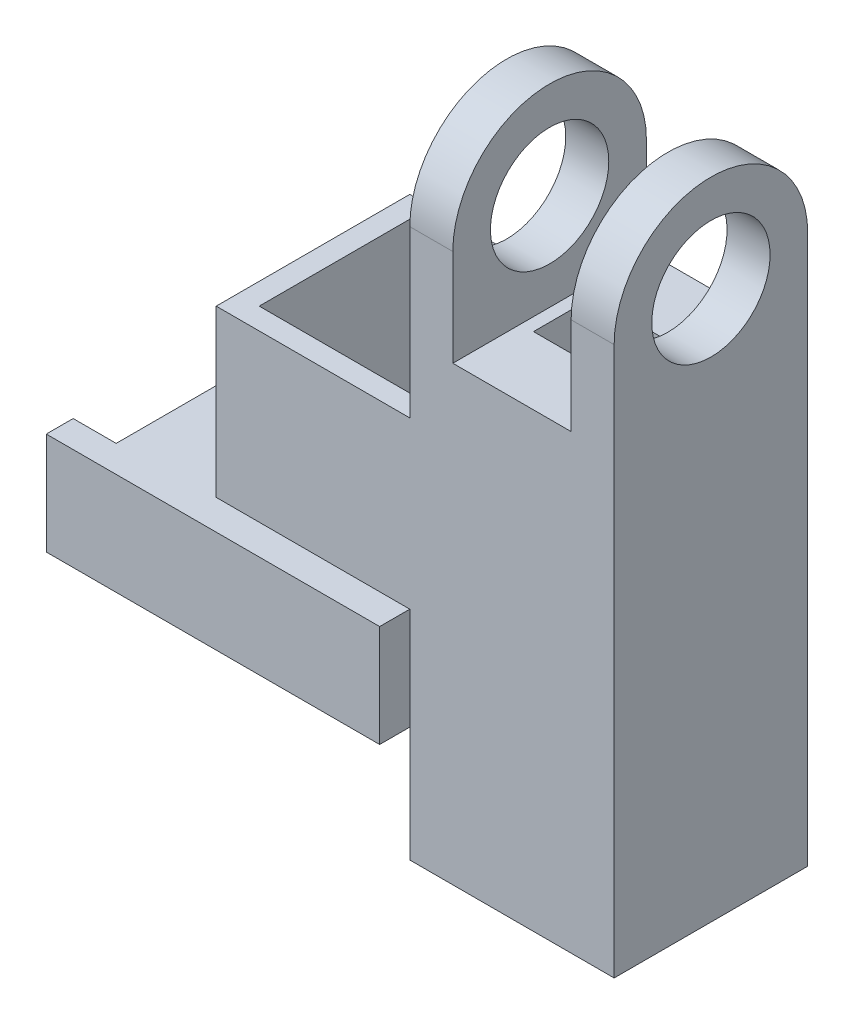
ISO-10303-21;
HEADER;
FILE_DESCRIPTION(('STEP AP214'),'2;1');
FILE_NAME('part.step','',(''),(''),'','','');
FILE_SCHEMA(('AUTOMOTIVE_DESIGN { 1 0 10303 214 1 1 1 1 }'));
ENDSEC;
DATA;
#1=APPLICATION_CONTEXT('core data for automotive mechanical design processes');
#2=APPLICATION_PROTOCOL_DEFINITION('international standard','automotive_design',2000,#1);
#3=PRODUCT_CONTEXT('',#1,'mechanical');
#4=PRODUCT('Part','Part','',(#3));
#5=PRODUCT_RELATED_PRODUCT_CATEGORY('part','',(#4));
#6=PRODUCT_DEFINITION_FORMATION('','',#4);
#7=PRODUCT_DEFINITION_CONTEXT('part definition',#1,'design');
#8=PRODUCT_DEFINITION('design','',#6,#7);
#9=PRODUCT_DEFINITION_SHAPE('','',#8);
#10=(LENGTH_UNIT() NAMED_UNIT(*) SI_UNIT(.MILLI.,.METRE.));
#11=(NAMED_UNIT(*) PLANE_ANGLE_UNIT() SI_UNIT($,.RADIAN.));
#12=(NAMED_UNIT(*) SI_UNIT($,.STERADIAN.) SOLID_ANGLE_UNIT());
#13=UNCERTAINTY_MEASURE_WITH_UNIT(LENGTH_MEASURE(1.E-05),#10,'distance_accuracy_value','');
#14=(GEOMETRIC_REPRESENTATION_CONTEXT(3) GLOBAL_UNCERTAINTY_ASSIGNED_CONTEXT((#13)) GLOBAL_UNIT_ASSIGNED_CONTEXT((#10,
#11,#12)) REPRESENTATION_CONTEXT('',''));
#15=CARTESIAN_POINT('',(0.,0.,0.));
#16=DIRECTION('',(0.,0.,1.));
#17=DIRECTION('',(1.,0.,0.));
#18=AXIS2_PLACEMENT_3D('',#15,#16,#17);
#19=CARTESIAN_POINT('',(-18.,-2.4,-18.));
#20=DIRECTION('',(0.,-1.,0.));
#21=DIRECTION('',(0.,0.,-1.));
#22=AXIS2_PLACEMENT_3D('',#19,#20,#21);
#23=PLANE('',#22);
#24=DIRECTION('',(-1.,0.,0.));
#25=VECTOR('',#24,1.);
#26=CARTESIAN_POINT('',(0.,-2.39999999999999,-2.));
#27=LINE('',#26,#25);
#28=CARTESIAN_POINT('',(0.,-2.39999999999999,-2.));
#29=VERTEX_POINT('',#28);
#30=CARTESIAN_POINT('',(-16.,-2.39999999999999,-2.));
#31=VERTEX_POINT('',#30);
#32=EDGE_CURVE('E54',#29,#31,#27,.T.);
#33=ORIENTED_EDGE('',*,*,#32,.T.);
#34=DIRECTION('',(0.,0.,-1.));
#35=VECTOR('',#34,1.);
#36=CARTESIAN_POINT('',(-16.,-2.39999999999999,0.));
#37=LINE('',#36,#35);
#38=CARTESIAN_POINT('',(-16.,-2.4,-16.));
#39=VERTEX_POINT('',#38);
#40=EDGE_CURVE('E251',#31,#39,#37,.T.);
#41=ORIENTED_EDGE('',*,*,#40,.T.);
#42=DIRECTION('',(1.,0.,0.));
#43=VECTOR('',#42,1.);
#44=CARTESIAN_POINT('',(0.,-2.4,-16.));
#45=LINE('',#44,#43);
#46=CARTESIAN_POINT('',(0.,-2.4,-16.));
#47=VERTEX_POINT('',#46);
#48=EDGE_CURVE('E236',#39,#47,#45,.T.);
#49=ORIENTED_EDGE('',*,*,#48,.T.);
#50=DIRECTION('',(0.,0.,-1.));
#51=VECTOR('',#50,1.);
#52=CARTESIAN_POINT('',(0.,-2.4,-18.));
#53=LINE('',#52,#51);
#54=CARTESIAN_POINT('',(0.,-2.4,-18.));
#55=VERTEX_POINT('',#54);
#56=EDGE_CURVE('E248',#47,#55,#53,.T.);
#57=ORIENTED_EDGE('',*,*,#56,.T.);
#58=DIRECTION('',(1.,0.,0.));
#59=VECTOR('',#58,1.);
#60=CARTESIAN_POINT('',(-18.,-2.4,-18.));
#61=LINE('',#60,#59);
#62=CARTESIAN_POINT('',(-18.,-2.4,-18.));
#63=VERTEX_POINT('',#62);
#64=EDGE_CURVE('E269',#63,#55,#61,.T.);
#65=ORIENTED_EDGE('',*,*,#64,.F.);
#66=DIRECTION('',(0.,0.,-1.));
#67=VECTOR('',#66,1.);
#68=CARTESIAN_POINT('',(-18.,-2.4,-18.));
#69=LINE('',#68,#67);
#70=CARTESIAN_POINT('',(-18.,-2.39999999999999,0.));
#71=VERTEX_POINT('',#70);
#72=EDGE_CURVE('E542',#71,#63,#69,.T.);
#73=ORIENTED_EDGE('',*,*,#72,.F.);
#74=DIRECTION('',(1.,0.,0.));
#75=VECTOR('',#74,1.);
#76=CARTESIAN_POINT('',(-18.,-2.39999999999999,0.));
#77=LINE('',#76,#75);
#78=CARTESIAN_POINT('',(0.,-2.39999999999999,0.));
#79=VERTEX_POINT('',#78);
#80=EDGE_CURVE('E271',#71,#79,#77,.T.);
#81=ORIENTED_EDGE('',*,*,#80,.T.);
#82=EDGE_CURVE('E257',#79,#29,#53,.T.);
#83=ORIENTED_EDGE('',*,*,#82,.T.);
#84=EDGE_LOOP('',(#33,#41,#49,#57,#65,#73,#81,#83));
#85=FACE_BOUND('',#84,.T.);
#86=ADVANCED_FACE('F36',(#85),#23,.F.);
#87=CARTESIAN_POINT('',(0.,13.,-9.));
#88=DIRECTION('',(1.,0.,0.));
#89=DIRECTION('',(0.,0.,-1.));
#90=AXIS2_PLACEMENT_3D('',#87,#88,#89);
#91=PLANE('',#90);
#92=CARTESIAN_POINT('',(0.,13.,-9.));
#93=DIRECTION('',(1.,0.,0.));
#94=DIRECTION('',(0.,0.,-1.));
#95=AXIS2_PLACEMENT_3D('',#92,#93,#94);
#96=CIRCLE('',#95,5.5);
#97=CARTESIAN_POINT('',(0.,13.,-14.5));
#98=VERTEX_POINT('',#97);
#99=EDGE_CURVE('E428',#98,#98,#96,.T.);
#100=ORIENTED_EDGE('',*,*,#99,.T.);
#101=EDGE_LOOP('',(#100));
#102=FACE_BOUND('',#101,.T.);
#103=ORIENTED_EDGE('',*,*,#82,.F.);
#104=DIRECTION('',(0.,-1.,0.));
#105=VECTOR('',#104,1.);
#106=CARTESIAN_POINT('',(0.,13.,0.));
#107=LINE('',#106,#105);
#108=CARTESIAN_POINT('',(0.,13.,0.));
#109=VERTEX_POINT('',#108);
#110=EDGE_CURVE('E472',#109,#79,#107,.T.);
#111=ORIENTED_EDGE('',*,*,#110,.F.);
#112=CARTESIAN_POINT('',(0.,13.,-9.));
#113=DIRECTION('',(1.,0.,0.));
#114=DIRECTION('',(0.,0.,-1.));
#115=AXIS2_PLACEMENT_3D('',#112,#113,#114);
#116=CIRCLE('',#115,9.);
#117=CARTESIAN_POINT('',(0.,13.,-18.));
#118=VERTEX_POINT('',#117);
#119=EDGE_CURVE('E439',#118,#109,#116,.T.);
#120=ORIENTED_EDGE('',*,*,#119,.F.);
#121=DIRECTION('',(0.,1.,0.));
#122=VECTOR('',#121,1.);
#123=CARTESIAN_POINT('',(0.,0.,-18.));
#124=LINE('',#123,#122);
#125=EDGE_CURVE('E40',#55,#118,#124,.T.);
#126=ORIENTED_EDGE('',*,*,#125,.F.);
#127=ORIENTED_EDGE('',*,*,#56,.F.);
#128=DIRECTION('',(0.,1.,0.));
#129=VECTOR('',#128,1.);
#130=CARTESIAN_POINT('',(0.,-39.0602916254693,-16.));
#131=LINE('',#130,#129);
#132=CARTESIAN_POINT('',(0.,-17.8,-16.));
#133=VERTEX_POINT('',#132);
#134=EDGE_CURVE('E232',#133,#47,#131,.T.);
#135=ORIENTED_EDGE('',*,*,#134,.F.);
#136=DIRECTION('',(0.,0.,1.));
#137=VECTOR('',#136,1.);
#138=CARTESIAN_POINT('',(0.,-17.8,0.));
#139=LINE('',#138,#137);
#140=CARTESIAN_POINT('',(0.,-17.8,-1.99999999999999));
#141=VERTEX_POINT('',#140);
#142=EDGE_CURVE('E258',#133,#141,#139,.T.);
#143=ORIENTED_EDGE('',*,*,#142,.T.);
#144=DIRECTION('',(0.,1.,0.));
#145=VECTOR('',#144,1.);
#146=CARTESIAN_POINT('',(0.,-39.0602916254693,-1.99999999999999));
#147=LINE('',#146,#145);
#148=EDGE_CURVE('E244',#141,#29,#147,.T.);
#149=ORIENTED_EDGE('',*,*,#148,.T.);
#150=EDGE_LOOP('',(#103,#111,#120,#126,#127,#135,#143,#149));
#151=FACE_BOUND('',#150,.T.);
#152=ADVANCED_FACE('F255',(#102,#151),#91,.F.);
#153=CARTESIAN_POINT('',(-24.,-17.8,0.));
#154=DIRECTION('',(0.,1.,0.));
#155=DIRECTION('',(0.,0.,1.));
#156=AXIS2_PLACEMENT_3D('',#153,#154,#155);
#157=PLANE('',#156);
#158=DIRECTION('',(0.,0.,1.));
#159=VECTOR('',#158,1.);
#160=CARTESIAN_POINT('',(0.,-17.8,0.));
#161=LINE('',#160,#159);
#162=CARTESIAN_POINT('',(0.,-17.8,0.));
#163=VERTEX_POINT('',#162);
#164=CARTESIAN_POINT('',(0.,-17.8,2.8));
#165=VERTEX_POINT('',#164);
#166=EDGE_CURVE('E349',#163,#165,#161,.T.);
#167=ORIENTED_EDGE('',*,*,#166,.F.);
#168=DIRECTION('',(1.,0.,0.));
#169=VECTOR('',#168,1.);
#170=CARTESIAN_POINT('',(-18.,-17.8,0.));
#171=LINE('',#170,#169);
#172=CARTESIAN_POINT('',(-18.,-17.8,0.));
#173=VERTEX_POINT('',#172);
#174=EDGE_CURVE('E273',#173,#163,#171,.T.);
#175=ORIENTED_EDGE('',*,*,#174,.F.);
#176=DIRECTION('',(0.,0.,1.));
#177=VECTOR('',#176,1.);
#178=CARTESIAN_POINT('',(-18.,-17.8,0.));
#179=LINE('',#178,#177);
#180=CARTESIAN_POINT('',(-18.,-17.8,-18.));
#181=VERTEX_POINT('',#180);
#182=EDGE_CURVE('E261',#181,#173,#179,.T.);
#183=ORIENTED_EDGE('',*,*,#182,.F.);
#184=DIRECTION('',(1.,0.,0.));
#185=VECTOR('',#184,1.);
#186=CARTESIAN_POINT('',(-18.,-17.8,-18.));
#187=LINE('',#186,#185);
#188=CARTESIAN_POINT('',(0.,-17.8,-18.));
#189=VERTEX_POINT('',#188);
#190=EDGE_CURVE('E62',#181,#189,#187,.T.);
#191=ORIENTED_EDGE('',*,*,#190,.T.);
#192=CARTESIAN_POINT('',(0.,-17.8,-20.8));
#193=VERTEX_POINT('',#192);
#194=EDGE_CURVE('E345',#193,#189,#161,.T.);
#195=ORIENTED_EDGE('',*,*,#194,.F.);
#196=DIRECTION('',(1.,0.,0.));
#197=VECTOR('',#196,1.);
#198=CARTESIAN_POINT('',(-28.,-17.8,-20.8));
#199=LINE('',#198,#197);
#200=CARTESIAN_POINT('',(-31.,-17.8,-20.8));
#201=VERTEX_POINT('',#200);
#202=EDGE_CURVE('E330',#201,#193,#199,.T.);
#203=ORIENTED_EDGE('',*,*,#202,.F.);
#204=DIRECTION('',(0.,0.,-1.));
#205=VECTOR('',#204,1.);
#206=CARTESIAN_POINT('',(-31.,-17.8,0.));
#207=LINE('',#206,#205);
#208=CARTESIAN_POINT('',(-31.,-17.8,-18.3));
#209=VERTEX_POINT('',#208);
#210=EDGE_CURVE('E287',#209,#201,#207,.T.);
#211=ORIENTED_EDGE('',*,*,#210,.F.);
#212=DIRECTION('',(1.,0.,0.));
#213=VECTOR('',#212,1.);
#214=CARTESIAN_POINT('',(-28.,-17.8,-18.3));
#215=LINE('',#214,#213);
#216=CARTESIAN_POINT('',(-27.,-17.8,-18.3));
#217=VERTEX_POINT('',#216);
#218=EDGE_CURVE('E332',#209,#217,#215,.T.);
#219=ORIENTED_EDGE('',*,*,#218,.T.);
#220=DIRECTION('',(0.,0.,-1.));
#221=VECTOR('',#220,1.);
#222=CARTESIAN_POINT('',(-27.,-17.8,0.300000000000002));
#223=LINE('',#222,#221);
#224=CARTESIAN_POINT('',(-27.,-17.8,0.300000000000002));
#225=VERTEX_POINT('',#224);
#226=EDGE_CURVE('E311',#225,#217,#223,.T.);
#227=ORIENTED_EDGE('',*,*,#226,.F.);
#228=DIRECTION('',(1.,0.,0.));
#229=VECTOR('',#228,1.);
#230=CARTESIAN_POINT('',(-28.,-17.8,0.300000000000002));
#231=LINE('',#230,#229);
#232=CARTESIAN_POINT('',(-31.,-17.8,0.300000000000002));
#233=VERTEX_POINT('',#232);
#234=EDGE_CURVE('E341',#233,#225,#231,.T.);
#235=ORIENTED_EDGE('',*,*,#234,.F.);
#236=DIRECTION('',(0.,0.,1.));
#237=VECTOR('',#236,1.);
#238=CARTESIAN_POINT('',(-31.,-17.8,0.));
#239=LINE('',#238,#237);
#240=CARTESIAN_POINT('',(-31.,-17.8,2.8));
#241=VERTEX_POINT('',#240);
#242=EDGE_CURVE('E275',#233,#241,#239,.T.);
#243=ORIENTED_EDGE('',*,*,#242,.T.);
#244=DIRECTION('',(1.,0.,0.));
#245=VECTOR('',#244,1.);
#246=CARTESIAN_POINT('',(-28.,-17.8,2.8));
#247=LINE('',#246,#245);
#248=EDGE_CURVE('E317',#241,#165,#247,.T.);
#249=ORIENTED_EDGE('',*,*,#248,.T.);
#250=EDGE_LOOP('',(#167,#175,#183,#191,#195,#203,#211,#219,#227,#235,#243,#249));
#251=FACE_BOUND('',#250,.T.);
#252=ADVANCED_FACE('F580',(#251),#157,.T.);
#253=DIRECTION('',(0.,0.,1.));
#254=VECTOR('',#253,1.);
#255=CARTESIAN_POINT('',(0.,-27.3,0.));
#256=LINE('',#255,#254);
#257=CARTESIAN_POINT('',(0.,-27.3,-18.));
#258=VERTEX_POINT('',#257);
#259=CARTESIAN_POINT('',(0.,-27.3,0.));
#260=VERTEX_POINT('',#259);
#261=EDGE_CURVE('E321',#258,#260,#256,.T.);
#262=ORIENTED_EDGE('',*,*,#261,.F.);
#263=CARTESIAN_POINT('',(0.,-38.,-18.));
#264=VERTEX_POINT('',#263);
#265=EDGE_CURVE('E443',#264,#258,#124,.T.);
#266=ORIENTED_EDGE('',*,*,#265,.F.);
#267=DIRECTION('',(0.,0.,-1.));
#268=VECTOR('',#267,1.);
#269=CARTESIAN_POINT('',(0.,-38.,0.));
#270=LINE('',#269,#268);
#271=CARTESIAN_POINT('',(0.,-38.,0.));
#272=VERTEX_POINT('',#271);
#273=EDGE_CURVE('E362',#272,#264,#270,.T.);
#274=ORIENTED_EDGE('',*,*,#273,.F.);
#275=EDGE_CURVE('E432',#260,#272,#107,.T.);
#276=ORIENTED_EDGE('',*,*,#275,.F.);
#277=EDGE_LOOP('',(#262,#266,#274,#276));
#278=FACE_BOUND('',#277,.T.);
#279=ADVANCED_FACE('F499',(#278),#91,.F.);
#280=CARTESIAN_POINT('',(19.,0.,0.));
#281=DIRECTION('',(0.,1.,0.));
#282=DIRECTION('',(0.,0.,1.));
#283=AXIS2_PLACEMENT_3D('',#280,#281,#282);
#284=PLANE('',#283);
#285=DIRECTION('',(0.,0.,1.));
#286=VECTOR('',#285,1.);
#287=CARTESIAN_POINT('',(5.2,0.,-6.3));
#288=LINE('',#287,#286);
#289=CARTESIAN_POINT('',(5.2,0.,-11.8));
#290=VERTEX_POINT('',#289);
#291=CARTESIAN_POINT('',(5.2,0.,-6.3));
#292=VERTEX_POINT('',#291);
#293=EDGE_CURVE('E382',#290,#292,#288,.T.);
#294=ORIENTED_EDGE('',*,*,#293,.T.);
#295=DIRECTION('',(1.,0.,0.));
#296=VECTOR('',#295,1.);
#297=CARTESIAN_POINT('',(5.2,0.,-6.3));
#298=LINE('',#297,#296);
#299=CARTESIAN_POINT('',(13.7,0.,-6.3));
#300=VERTEX_POINT('',#299);
#301=EDGE_CURVE('E385',#292,#300,#298,.T.);
#302=ORIENTED_EDGE('',*,*,#301,.T.);
#303=DIRECTION('',(0.,0.,-1.));
#304=VECTOR('',#303,1.);
#305=CARTESIAN_POINT('',(13.7,0.,-6.3));
#306=LINE('',#305,#304);
#307=CARTESIAN_POINT('',(13.7,0.,-11.8));
#308=VERTEX_POINT('',#307);
#309=EDGE_CURVE('E388',#300,#308,#306,.T.);
#310=ORIENTED_EDGE('',*,*,#309,.T.);
#311=DIRECTION('',(-1.,0.,0.));
#312=VECTOR('',#311,1.);
#313=CARTESIAN_POINT('',(5.2,0.,-11.8));
#314=LINE('',#313,#312);
#315=EDGE_CURVE('E391',#308,#290,#314,.T.);
#316=ORIENTED_EDGE('',*,*,#315,.T.);
#317=EDGE_LOOP('',(#294,#302,#310,#316));
#318=FACE_BOUND('',#317,.T.);
#319=CARTESIAN_POINT('',(9.5,0.,-9.));
#320=DIRECTION('',(0.,-1.,0.));
#321=DIRECTION('',(0.,0.,-1.));
#322=AXIS2_PLACEMENT_3D('',#319,#320,#321);
#323=CIRCLE('',#322,8.);
#324=CARTESIAN_POINT('',(9.5,0.,-17.));
#325=VERTEX_POINT('',#324);
#326=EDGE_CURVE('E368',#325,#325,#323,.T.);
#327=ORIENTED_EDGE('',*,*,#326,.T.);
#328=EDGE_LOOP('',(#327));
#329=FACE_BOUND('',#328,.T.);
#330=ADVANCED_FACE('F656',(#318,#329),#284,.F.);
#331=CARTESIAN_POINT('',(0.,4.,-18.));
#332=DIRECTION('',(0.,1.,0.));
#333=DIRECTION('',(-1.,0.,0.));
#334=AXIS2_PLACEMENT_3D('',#331,#332,#333);
#335=PLANE('',#334);
#336=DIRECTION('',(1.,0.,0.));
#337=VECTOR('',#336,1.);
#338=CARTESIAN_POINT('',(19.,4.,0.));
#339=LINE('',#338,#337);
#340=CARTESIAN_POINT('',(4.,4.,0.));
#341=VERTEX_POINT('',#340);
#342=CARTESIAN_POINT('',(15.,4.,0.));
#343=VERTEX_POINT('',#342);
#344=EDGE_CURVE('E426',#341,#343,#339,.T.);
#345=ORIENTED_EDGE('',*,*,#344,.T.);
#346=DIRECTION('',(0.,0.,1.));
#347=VECTOR('',#346,1.);
#348=CARTESIAN_POINT('',(15.,4.,-18.));
#349=LINE('',#348,#347);
#350=CARTESIAN_POINT('',(15.,4.,-18.));
#351=VERTEX_POINT('',#350);
#352=EDGE_CURVE('E411',#351,#343,#349,.T.);
#353=ORIENTED_EDGE('',*,*,#352,.F.);
#354=DIRECTION('',(-1.,0.,0.));
#355=VECTOR('',#354,1.);
#356=CARTESIAN_POINT('',(0.,4.,-18.));
#357=LINE('',#356,#355);
#358=CARTESIAN_POINT('',(4.,4.,-18.));
#359=VERTEX_POINT('',#358);
#360=EDGE_CURVE('E406',#351,#359,#357,.T.);
#361=ORIENTED_EDGE('',*,*,#360,.T.);
#362=DIRECTION('',(0.,0.,1.));
#363=VECTOR('',#362,1.);
#364=CARTESIAN_POINT('',(4.,4.,-18.));
#365=LINE('',#364,#363);
#366=EDGE_CURVE('E410',#359,#341,#365,.T.);
#367=ORIENTED_EDGE('',*,*,#366,.T.);
#368=EDGE_LOOP('',(#345,#353,#361,#367));
#369=FACE_BOUND('',#368,.T.);
#370=DIRECTION('',(-1.,0.,0.));
#371=VECTOR('',#370,1.);
#372=CARTESIAN_POINT('',(0.,4.,-6.3));
#373=LINE('',#372,#371);
#374=CARTESIAN_POINT('',(13.7,4.,-6.3));
#375=VERTEX_POINT('',#374);
#376=CARTESIAN_POINT('',(5.2,4.,-6.3));
#377=VERTEX_POINT('',#376);
#378=EDGE_CURVE('E46',#375,#377,#373,.T.);
#379=ORIENTED_EDGE('',*,*,#378,.T.);
#380=DIRECTION('',(0.,0.,-1.));
#381=VECTOR('',#380,1.);
#382=CARTESIAN_POINT('',(5.2,4.,-18.));
#383=LINE('',#382,#381);
#384=CARTESIAN_POINT('',(5.2,4.,-11.8));
#385=VERTEX_POINT('',#384);
#386=EDGE_CURVE('E12',#377,#385,#383,.T.);
#387=ORIENTED_EDGE('',*,*,#386,.T.);
#388=DIRECTION('',(1.,0.,0.));
#389=VECTOR('',#388,1.);
#390=CARTESIAN_POINT('',(0.,4.,-11.8));
#391=LINE('',#390,#389);
#392=CARTESIAN_POINT('',(13.7,4.,-11.8));
#393=VERTEX_POINT('',#392);
#394=EDGE_CURVE('E451',#385,#393,#391,.T.);
#395=ORIENTED_EDGE('',*,*,#394,.T.);
#396=DIRECTION('',(0.,0.,1.));
#397=VECTOR('',#396,1.);
#398=CARTESIAN_POINT('',(13.7,4.,-18.));
#399=LINE('',#398,#397);
#400=EDGE_CURVE('E458',#393,#375,#399,.T.);
#401=ORIENTED_EDGE('',*,*,#400,.T.);
#402=EDGE_LOOP('',(#379,#387,#395,#401));
#403=FACE_BOUND('',#402,.T.);
#404=ADVANCED_FACE('F527',(#369,#403),#335,.T.);
#405=CARTESIAN_POINT('',(19.,13.,0.));
#406=DIRECTION('',(0.,0.,-1.));
#407=DIRECTION('',(-1.,0.,0.));
#408=AXIS2_PLACEMENT_3D('',#405,#406,#407);
#409=PLANE('',#408);
#410=ORIENTED_EDGE('',*,*,#110,.T.);
#411=ORIENTED_EDGE('',*,*,#80,.F.);
#412=DIRECTION('',(0.,1.,0.));
#413=VECTOR('',#412,1.);
#414=CARTESIAN_POINT('',(-18.,-2.39999999999999,0.));
#415=LINE('',#414,#413);
#416=EDGE_CURVE('E540',#173,#71,#415,.T.);
#417=ORIENTED_EDGE('',*,*,#416,.F.);
#418=ORIENTED_EDGE('',*,*,#174,.T.);
#419=EDGE_CURVE('E476',#163,#260,#107,.T.);
#420=ORIENTED_EDGE('',*,*,#419,.T.);
#421=ORIENTED_EDGE('',*,*,#275,.T.);
#422=DIRECTION('',(1.,0.,0.));
#423=VECTOR('',#422,1.);
#424=CARTESIAN_POINT('',(0.,-38.,0.));
#425=LINE('',#424,#423);
#426=CARTESIAN_POINT('',(19.,-38.,0.));
#427=VERTEX_POINT('',#426);
#428=EDGE_CURVE('E359',#272,#427,#425,.T.);
#429=ORIENTED_EDGE('',*,*,#428,.T.);
#430=DIRECTION('',(0.,-1.,0.));
#431=VECTOR('',#430,1.);
#432=CARTESIAN_POINT('',(19.,13.,0.));
#433=LINE('',#432,#431);
#434=CARTESIAN_POINT('',(19.,13.,0.));
#435=VERTEX_POINT('',#434);
#436=EDGE_CURVE('E442',#435,#427,#433,.T.);
#437=ORIENTED_EDGE('',*,*,#436,.F.);
#438=DIRECTION('',(-1.,0.,0.));
#439=VECTOR('',#438,1.);
#440=CARTESIAN_POINT('',(19.,13.,0.));
#441=LINE('',#440,#439);
#442=CARTESIAN_POINT('',(15.,13.,0.));
#443=VERTEX_POINT('',#442);
#444=EDGE_CURVE('E444',#435,#443,#441,.T.);
#445=ORIENTED_EDGE('',*,*,#444,.T.);
#446=DIRECTION('',(0.,1.,0.));
#447=VECTOR('',#446,1.);
#448=CARTESIAN_POINT('',(15.,13.,0.));
#449=LINE('',#448,#447);
#450=EDGE_CURVE('E424',#343,#443,#449,.T.);
#451=ORIENTED_EDGE('',*,*,#450,.F.);
#452=ORIENTED_EDGE('',*,*,#344,.F.);
#453=DIRECTION('',(0.,-1.,0.));
#454=VECTOR('',#453,1.);
#455=CARTESIAN_POINT('',(4.,13.,0.));
#456=LINE('',#455,#454);
#457=CARTESIAN_POINT('',(4.,13.,0.));
#458=VERTEX_POINT('',#457);
#459=EDGE_CURVE('E419',#458,#341,#456,.T.);
#460=ORIENTED_EDGE('',*,*,#459,.F.);
#461=EDGE_CURVE('E437',#458,#109,#441,.T.);
#462=ORIENTED_EDGE('',*,*,#461,.T.);
#463=EDGE_LOOP('',(#410,#411,#417,#418,#420,#421,#429,#437,#445,#451,#452,#460,#462));
#464=FACE_BOUND('',#463,.T.);
#465=ADVANCED_FACE('F38',(#464),#409,.F.);
#466=CARTESIAN_POINT('',(19.,0.,-18.));
#467=DIRECTION('',(0.,0.,1.));
#468=DIRECTION('',(1.,0.,0.));
#469=AXIS2_PLACEMENT_3D('',#466,#467,#468);
#470=PLANE('',#469);
#471=DIRECTION('',(0.,1.,0.));
#472=VECTOR('',#471,1.);
#473=CARTESIAN_POINT('',(0.,0.,-18.));
#474=LINE('',#473,#472);
#475=EDGE_CURVE('E352',#258,#189,#474,.T.);
#476=ORIENTED_EDGE('',*,*,#475,.T.);
#477=ORIENTED_EDGE('',*,*,#190,.F.);
#478=DIRECTION('',(0.,-1.,0.));
#479=VECTOR('',#478,1.);
#480=CARTESIAN_POINT('',(-18.,-17.8,-18.));
#481=LINE('',#480,#479);
#482=EDGE_CURVE('E266',#63,#181,#481,.T.);
#483=ORIENTED_EDGE('',*,*,#482,.F.);
#484=ORIENTED_EDGE('',*,*,#64,.T.);
#485=ORIENTED_EDGE('',*,*,#125,.T.);
#486=DIRECTION('',(-1.,0.,0.));
#487=VECTOR('',#486,1.);
#488=CARTESIAN_POINT('',(19.,13.,-18.));
#489=LINE('',#488,#487);
#490=CARTESIAN_POINT('',(4.,13.,-18.));
#491=VERTEX_POINT('',#490);
#492=EDGE_CURVE('E447',#491,#118,#489,.T.);
#493=ORIENTED_EDGE('',*,*,#492,.F.);
#494=DIRECTION('',(0.,1.,0.));
#495=VECTOR('',#494,1.);
#496=CARTESIAN_POINT('',(4.,0.,-18.));
#497=LINE('',#496,#495);
#498=EDGE_CURVE('E403',#359,#491,#497,.T.);
#499=ORIENTED_EDGE('',*,*,#498,.F.);
#500=ORIENTED_EDGE('',*,*,#360,.F.);
#501=DIRECTION('',(0.,-1.,0.));
#502=VECTOR('',#501,1.);
#503=CARTESIAN_POINT('',(15.,0.,-18.));
#504=LINE('',#503,#502);
#505=CARTESIAN_POINT('',(15.,13.,-18.));
#506=VERTEX_POINT('',#505);
#507=EDGE_CURVE('E408',#506,#351,#504,.T.);
#508=ORIENTED_EDGE('',*,*,#507,.F.);
#509=CARTESIAN_POINT('',(19.,13.,-18.));
#510=VERTEX_POINT('',#509);
#511=EDGE_CURVE('E448',#510,#506,#489,.T.);
#512=ORIENTED_EDGE('',*,*,#511,.F.);
#513=DIRECTION('',(0.,1.,0.));
#514=VECTOR('',#513,1.);
#515=CARTESIAN_POINT('',(19.,0.,-18.));
#516=LINE('',#515,#514);
#517=CARTESIAN_POINT('',(19.,-38.,-18.));
#518=VERTEX_POINT('',#517);
#519=EDGE_CURVE('E438',#518,#510,#516,.T.);
#520=ORIENTED_EDGE('',*,*,#519,.F.);
#521=DIRECTION('',(1.,0.,0.));
#522=VECTOR('',#521,1.);
#523=CARTESIAN_POINT('',(0.,-38.,-18.));
#524=LINE('',#523,#522);
#525=EDGE_CURVE('E369',#264,#518,#524,.T.);
#526=ORIENTED_EDGE('',*,*,#525,.F.);
#527=ORIENTED_EDGE('',*,*,#265,.T.);
#528=EDGE_LOOP('',(#476,#477,#483,#484,#485,#493,#499,#500,#508,#512,#520,#526,#527));
#529=FACE_BOUND('',#528,.T.);
#530=ADVANCED_FACE('F501',(#529),#470,.F.);
#531=CARTESIAN_POINT('',(19.,13.,-9.));
#532=DIRECTION('',(-1.,0.,0.));
#533=DIRECTION('',(0.,0.,1.));
#534=AXIS2_PLACEMENT_3D('',#531,#532,#533);
#535=CYLINDRICAL_SURFACE('',#534,9.);
#536=CARTESIAN_POINT('',(15.,13.,-9.));
#537=DIRECTION('',(-1.,0.,0.));
#538=DIRECTION('',(0.,-1.,0.));
#539=AXIS2_PLACEMENT_3D('',#536,#537,#538);
#540=CIRCLE('',#539,9.);
#541=EDGE_CURVE('E422',#443,#506,#540,.T.);
#542=ORIENTED_EDGE('',*,*,#541,.F.);
#543=ORIENTED_EDGE('',*,*,#444,.F.);
#544=CARTESIAN_POINT('',(19.,13.,-9.));
#545=DIRECTION('',(1.,0.,0.));
#546=DIRECTION('',(0.,0.,-1.));
#547=AXIS2_PLACEMENT_3D('',#544,#545,#546);
#548=CIRCLE('',#547,9.);
#549=EDGE_CURVE('E435',#510,#435,#548,.T.);
#550=ORIENTED_EDGE('',*,*,#549,.F.);
#551=ORIENTED_EDGE('',*,*,#511,.T.);
#552=EDGE_LOOP('',(#542,#543,#550,#551));
#553=FACE_BOUND('',#552,.T.);
#554=ADVANCED_FACE('F517',(#553),#535,.T.);
#555=CARTESIAN_POINT('',(4.,13.,-9.));
#556=DIRECTION('',(1.,0.,0.));
#557=DIRECTION('',(0.,0.,-1.));
#558=AXIS2_PLACEMENT_3D('',#555,#556,#557);
#559=CIRCLE('',#558,9.);
#560=EDGE_CURVE('E417',#491,#458,#559,.T.);
#561=ORIENTED_EDGE('',*,*,#560,.F.);
#562=ORIENTED_EDGE('',*,*,#492,.T.);
#563=ORIENTED_EDGE('',*,*,#119,.T.);
#564=ORIENTED_EDGE('',*,*,#461,.F.);
#565=EDGE_LOOP('',(#561,#562,#563,#564));
#566=FACE_BOUND('',#565,.T.);
#567=ADVANCED_FACE('F535',(#566),#535,.T.);
#568=CARTESIAN_POINT('',(19.,13.,-9.));
#569=DIRECTION('',(-1.,0.,0.));
#570=DIRECTION('',(0.,0.,1.));
#571=AXIS2_PLACEMENT_3D('',#568,#569,#570);
#572=CYLINDRICAL_SURFACE('',#571,5.5);
#573=CARTESIAN_POINT('',(19.,13.,-9.));
#574=DIRECTION('',(1.,0.,0.));
#575=DIRECTION('',(0.,0.,-1.));
#576=AXIS2_PLACEMENT_3D('',#573,#574,#575);
#577=CIRCLE('',#576,5.5);
#578=CARTESIAN_POINT('',(19.,13.,-14.5));
#579=VERTEX_POINT('',#578);
#580=EDGE_CURVE('E429',#579,#579,#577,.T.);
#581=ORIENTED_EDGE('',*,*,#580,.T.);
#582=EDGE_LOOP('',(#581));
#583=FACE_BOUND('',#582,.T.);
#584=CARTESIAN_POINT('',(15.,13.,-9.));
#585=DIRECTION('',(-1.,0.,0.));
#586=DIRECTION('',(0.,-1.,0.));
#587=AXIS2_PLACEMENT_3D('',#584,#585,#586);
#588=CIRCLE('',#587,5.5);
#589=CARTESIAN_POINT('',(15.,7.5,-9.));
#590=VERTEX_POINT('',#589);
#591=EDGE_CURVE('E421',#590,#590,#588,.T.);
#592=ORIENTED_EDGE('',*,*,#591,.T.);
#593=EDGE_LOOP('',(#592));
#594=FACE_BOUND('',#593,.T.);
#595=ADVANCED_FACE('F660',(#583,#594),#572,.F.);
#596=ORIENTED_EDGE('',*,*,#99,.F.);
#597=EDGE_LOOP('',(#596));
#598=FACE_BOUND('',#597,.T.);
#599=CARTESIAN_POINT('',(4.,13.,-9.));
#600=DIRECTION('',(1.,0.,0.));
#601=DIRECTION('',(0.,0.,-1.));
#602=AXIS2_PLACEMENT_3D('',#599,#600,#601);
#603=CIRCLE('',#602,5.5);
#604=CARTESIAN_POINT('',(4.,13.,-14.5));
#605=VERTEX_POINT('',#604);
#606=EDGE_CURVE('E414',#605,#605,#603,.T.);
#607=ORIENTED_EDGE('',*,*,#606,.T.);
#608=EDGE_LOOP('',(#607));
#609=FACE_BOUND('',#608,.T.);
#610=ADVANCED_FACE('F663',(#598,#609),#572,.F.);
#611=CARTESIAN_POINT('',(19.,13.,-9.));
#612=DIRECTION('',(1.,0.,0.));
#613=DIRECTION('',(0.,0.,-1.));
#614=AXIS2_PLACEMENT_3D('',#611,#612,#613);
#615=PLANE('',#614);
#616=ORIENTED_EDGE('',*,*,#436,.T.);
#617=DIRECTION('',(0.,0.,-1.));
#618=VECTOR('',#617,1.);
#619=CARTESIAN_POINT('',(19.,-38.,0.));
#620=LINE('',#619,#618);
#621=EDGE_CURVE('E365',#427,#518,#620,.T.);
#622=ORIENTED_EDGE('',*,*,#621,.T.);
#623=ORIENTED_EDGE('',*,*,#519,.T.);
#624=ORIENTED_EDGE('',*,*,#549,.T.);
#625=EDGE_LOOP('',(#616,#622,#623,#624));
#626=FACE_BOUND('',#625,.T.);
#627=ORIENTED_EDGE('',*,*,#580,.F.);
#628=EDGE_LOOP('',(#627));
#629=FACE_BOUND('',#628,.T.);
#630=ADVANCED_FACE('F512',(#626,#629),#615,.T.);
#631=CARTESIAN_POINT('',(15.,0.,-18.));
#632=DIRECTION('',(-1.,0.,0.));
#633=DIRECTION('',(0.,-1.,0.));
#634=AXIS2_PLACEMENT_3D('',#631,#632,#633);
#635=PLANE('',#634);
#636=ORIENTED_EDGE('',*,*,#591,.F.);
#637=EDGE_LOOP('',(#636));
#638=FACE_BOUND('',#637,.T.);
#639=ORIENTED_EDGE('',*,*,#450,.T.);
#640=ORIENTED_EDGE('',*,*,#541,.T.);
#641=ORIENTED_EDGE('',*,*,#507,.T.);
#642=ORIENTED_EDGE('',*,*,#352,.T.);
#643=EDGE_LOOP('',(#639,#640,#641,#642));
#644=FACE_BOUND('',#643,.T.);
#645=ADVANCED_FACE('F520',(#638,#644),#635,.T.);
#646=CARTESIAN_POINT('',(4.,0.,-18.));
#647=DIRECTION('',(1.,0.,0.));
#648=DIRECTION('',(0.,0.,-1.));
#649=AXIS2_PLACEMENT_3D('',#646,#647,#648);
#650=PLANE('',#649);
#651=ORIENTED_EDGE('',*,*,#606,.F.);
#652=EDGE_LOOP('',(#651));
#653=FACE_BOUND('',#652,.T.);
#654=ORIENTED_EDGE('',*,*,#459,.T.);
#655=ORIENTED_EDGE('',*,*,#366,.F.);
#656=ORIENTED_EDGE('',*,*,#498,.T.);
#657=ORIENTED_EDGE('',*,*,#560,.T.);
#658=EDGE_LOOP('',(#654,#655,#656,#657));
#659=FACE_BOUND('',#658,.T.);
#660=ADVANCED_FACE('F531',(#653,#659),#650,.T.);
#661=CARTESIAN_POINT('',(5.2,19.,-6.3));
#662=DIRECTION('',(1.,0.,0.));
#663=DIRECTION('',(0.,0.,-1.));
#664=AXIS2_PLACEMENT_3D('',#661,#662,#663);
#665=PLANE('',#664);
#666=DIRECTION('',(0.,-1.,0.));
#667=VECTOR('',#666,1.);
#668=CARTESIAN_POINT('',(5.2,19.,-6.3));
#669=LINE('',#668,#667);
#670=EDGE_CURVE('E401',#377,#292,#669,.T.);
#671=ORIENTED_EDGE('',*,*,#670,.T.);
#672=ORIENTED_EDGE('',*,*,#293,.F.);
#673=DIRECTION('',(0.,-1.,0.));
#674=VECTOR('',#673,1.);
#675=CARTESIAN_POINT('',(5.2,19.,-11.8));
#676=LINE('',#675,#674);
#677=EDGE_CURVE('E394',#385,#290,#676,.T.);
#678=ORIENTED_EDGE('',*,*,#677,.F.);
#679=ORIENTED_EDGE('',*,*,#386,.F.);
#680=EDGE_LOOP('',(#671,#672,#678,#679));
#681=FACE_BOUND('',#680,.T.);
#682=ADVANCED_FACE('F646',(#681),#665,.T.);
#683=CARTESIAN_POINT('',(5.2,19.,-6.3));
#684=DIRECTION('',(0.,0.,-1.));
#685=DIRECTION('',(-1.,0.,0.));
#686=AXIS2_PLACEMENT_3D('',#683,#684,#685);
#687=PLANE('',#686);
#688=DIRECTION('',(0.,-1.,0.));
#689=VECTOR('',#688,1.);
#690=CARTESIAN_POINT('',(13.7,19.,-6.3));
#691=LINE('',#690,#689);
#692=EDGE_CURVE('E399',#375,#300,#691,.T.);
#693=ORIENTED_EDGE('',*,*,#692,.T.);
#694=ORIENTED_EDGE('',*,*,#301,.F.);
#695=ORIENTED_EDGE('',*,*,#670,.F.);
#696=ORIENTED_EDGE('',*,*,#378,.F.);
#697=EDGE_LOOP('',(#693,#694,#695,#696));
#698=FACE_BOUND('',#697,.T.);
#699=ADVANCED_FACE('F642',(#698),#687,.T.);
#700=CARTESIAN_POINT('',(13.7,19.,-6.3));
#701=DIRECTION('',(-1.,0.,0.));
#702=DIRECTION('',(0.,0.,1.));
#703=AXIS2_PLACEMENT_3D('',#700,#701,#702);
#704=PLANE('',#703);
#705=DIRECTION('',(0.,-1.,0.));
#706=VECTOR('',#705,1.);
#707=CARTESIAN_POINT('',(13.7,19.,-11.8));
#708=LINE('',#707,#706);
#709=EDGE_CURVE('E397',#393,#308,#708,.T.);
#710=ORIENTED_EDGE('',*,*,#709,.T.);
#711=ORIENTED_EDGE('',*,*,#309,.F.);
#712=ORIENTED_EDGE('',*,*,#692,.F.);
#713=ORIENTED_EDGE('',*,*,#400,.F.);
#714=EDGE_LOOP('',(#710,#711,#712,#713));
#715=FACE_BOUND('',#714,.T.);
#716=ADVANCED_FACE('F638',(#715),#704,.T.);
#717=CARTESIAN_POINT('',(5.2,19.,-11.8));
#718=DIRECTION('',(0.,0.,1.));
#719=DIRECTION('',(1.,0.,0.));
#720=AXIS2_PLACEMENT_3D('',#717,#718,#719);
#721=PLANE('',#720);
#722=ORIENTED_EDGE('',*,*,#677,.T.);
#723=ORIENTED_EDGE('',*,*,#315,.F.);
#724=ORIENTED_EDGE('',*,*,#709,.F.);
#725=ORIENTED_EDGE('',*,*,#394,.F.);
#726=EDGE_LOOP('',(#722,#723,#724,#725));
#727=FACE_BOUND('',#726,.T.);
#728=ADVANCED_FACE('F634',(#727),#721,.T.);
#729=CARTESIAN_POINT('',(9.5,-20.,-9.));
#730=DIRECTION('',(0.,1.,0.));
#731=DIRECTION('',(0.,0.,1.));
#732=AXIS2_PLACEMENT_3D('',#729,#730,#731);
#733=CYLINDRICAL_SURFACE('',#732,8.);
#734=ORIENTED_EDGE('',*,*,#326,.F.);
#735=EDGE_LOOP('',(#734));
#736=FACE_BOUND('',#735,.T.);
#737=CARTESIAN_POINT('',(9.5,-38.,-9.));
#738=DIRECTION('',(0.,1.,0.));
#739=DIRECTION('',(0.,0.,1.));
#740=AXIS2_PLACEMENT_3D('',#737,#738,#739);
#741=CIRCLE('',#740,8.);
#742=CARTESIAN_POINT('',(9.5,-38.,-1.));
#743=VERTEX_POINT('',#742);
#744=EDGE_CURVE('E356',#743,#743,#741,.T.);
#745=ORIENTED_EDGE('',*,*,#744,.F.);
#746=EDGE_LOOP('',(#745));
#747=FACE_BOUND('',#746,.T.);
#748=ADVANCED_FACE('F631',(#736,#747),#733,.F.);
#749=CARTESIAN_POINT('',(0.,-38.,0.));
#750=DIRECTION('',(0.,-1.,0.));
#751=DIRECTION('',(0.,0.,-1.));
#752=AXIS2_PLACEMENT_3D('',#749,#750,#751);
#753=PLANE('',#752);
#754=ORIENTED_EDGE('',*,*,#621,.F.);
#755=ORIENTED_EDGE('',*,*,#428,.F.);
#756=ORIENTED_EDGE('',*,*,#273,.T.);
#757=ORIENTED_EDGE('',*,*,#525,.T.);
#758=EDGE_LOOP('',(#754,#755,#756,#757));
#759=FACE_BOUND('',#758,.T.);
#760=ORIENTED_EDGE('',*,*,#744,.T.);
#761=EDGE_LOOP('',(#760));
#762=FACE_BOUND('',#761,.T.);
#763=ADVANCED_FACE('F506',(#759,#762),#753,.T.);
#764=CARTESIAN_POINT('',(0.,13.,-9.));
#765=DIRECTION('',(1.,0.,0.));
#766=DIRECTION('',(0.,0.,-1.));
#767=AXIS2_PLACEMENT_3D('',#764,#765,#766);
#768=PLANE('',#767);
#769=ORIENTED_EDGE('',*,*,#419,.F.);
#770=ORIENTED_EDGE('',*,*,#166,.T.);
#771=DIRECTION('',(0.,1.,0.));
#772=VECTOR('',#771,1.);
#773=CARTESIAN_POINT('',(0.,0.,2.8));
#774=LINE('',#773,#772);
#775=CARTESIAN_POINT('',(0.,-27.3,2.8));
#776=VERTEX_POINT('',#775);
#777=EDGE_CURVE('E313',#776,#165,#774,.T.);
#778=ORIENTED_EDGE('',*,*,#777,.F.);
#779=EDGE_CURVE('E322',#260,#776,#256,.T.);
#780=ORIENTED_EDGE('',*,*,#779,.F.);
#781=EDGE_LOOP('',(#769,#770,#778,#780));
#782=FACE_BOUND('',#781,.T.);
#783=ADVANCED_FACE('F493',(#782),#768,.T.);
#784=ORIENTED_EDGE('',*,*,#475,.F.);
#785=CARTESIAN_POINT('',(0.,-27.3,-20.8));
#786=VERTEX_POINT('',#785);
#787=EDGE_CURVE('E318',#786,#258,#256,.T.);
#788=ORIENTED_EDGE('',*,*,#787,.F.);
#789=DIRECTION('',(0.,1.,0.));
#790=VECTOR('',#789,1.);
#791=CARTESIAN_POINT('',(0.,0.,-20.8));
#792=LINE('',#791,#790);
#793=EDGE_CURVE('E314',#786,#193,#792,.T.);
#794=ORIENTED_EDGE('',*,*,#793,.T.);
#795=ORIENTED_EDGE('',*,*,#194,.T.);
#796=EDGE_LOOP('',(#784,#788,#794,#795));
#797=FACE_BOUND('',#796,.T.);
#798=ADVANCED_FACE('F615',(#797),#768,.T.);
#799=CARTESIAN_POINT('',(-28.,0.,0.300000000000002));
#800=DIRECTION('',(0.,0.,-1.));
#801=DIRECTION('',(-1.,0.,0.));
#802=AXIS2_PLACEMENT_3D('',#799,#800,#801);
#803=PLANE('',#802);
#804=DIRECTION('',(0.,1.,0.));
#805=VECTOR('',#804,1.);
#806=CARTESIAN_POINT('',(-27.,-24.8,0.300000000000002));
#807=LINE('',#806,#805);
#808=CARTESIAN_POINT('',(-27.,-24.8,0.300000000000002));
#809=VERTEX_POINT('',#808);
#810=EDGE_CURVE('E309',#809,#225,#807,.T.);
#811=ORIENTED_EDGE('',*,*,#810,.F.);
#812=DIRECTION('',(1.,0.,0.));
#813=VECTOR('',#812,1.);
#814=CARTESIAN_POINT('',(-28.,-24.8,0.300000000000002));
#815=LINE('',#814,#813);
#816=CARTESIAN_POINT('',(-31.,-24.8,0.300000000000002));
#817=VERTEX_POINT('',#816);
#818=EDGE_CURVE('E338',#817,#809,#815,.T.);
#819=ORIENTED_EDGE('',*,*,#818,.F.);
#820=DIRECTION('',(0.,1.,0.));
#821=VECTOR('',#820,1.);
#822=CARTESIAN_POINT('',(-31.,0.,0.300000000000002));
#823=LINE('',#822,#821);
#824=EDGE_CURVE('E278',#817,#233,#823,.T.);
#825=ORIENTED_EDGE('',*,*,#824,.T.);
#826=ORIENTED_EDGE('',*,*,#234,.T.);
#827=EDGE_LOOP('',(#811,#819,#825,#826));
#828=FACE_BOUND('',#827,.T.);
#829=ADVANCED_FACE('F611',(#828),#803,.T.);
#830=CARTESIAN_POINT('',(-28.,-24.8,0.));
#831=DIRECTION('',(0.,1.,0.));
#832=DIRECTION('',(0.,0.,1.));
#833=AXIS2_PLACEMENT_3D('',#830,#831,#832);
#834=PLANE('',#833);
#835=DIRECTION('',(0.,0.,1.));
#836=VECTOR('',#835,1.);
#837=CARTESIAN_POINT('',(-27.,-24.8,-18.3));
#838=LINE('',#837,#836);
#839=CARTESIAN_POINT('',(-27.,-24.8,-18.3));
#840=VERTEX_POINT('',#839);
#841=EDGE_CURVE('E307',#840,#809,#838,.T.);
#842=ORIENTED_EDGE('',*,*,#841,.F.);
#843=DIRECTION('',(1.,0.,0.));
#844=VECTOR('',#843,1.);
#845=CARTESIAN_POINT('',(-28.,-24.8,-18.3));
#846=LINE('',#845,#844);
#847=CARTESIAN_POINT('',(-31.,-24.8,-18.3));
#848=VERTEX_POINT('',#847);
#849=EDGE_CURVE('E335',#848,#840,#846,.T.);
#850=ORIENTED_EDGE('',*,*,#849,.F.);
#851=DIRECTION('',(0.,0.,1.));
#852=VECTOR('',#851,1.);
#853=CARTESIAN_POINT('',(-31.,-24.8,0.));
#854=LINE('',#853,#852);
#855=EDGE_CURVE('E281',#848,#817,#854,.T.);
#856=ORIENTED_EDGE('',*,*,#855,.T.);
#857=ORIENTED_EDGE('',*,*,#818,.T.);
#858=EDGE_LOOP('',(#842,#850,#856,#857));
#859=FACE_BOUND('',#858,.T.);
#860=ADVANCED_FACE('F607',(#859),#834,.T.);
#861=CARTESIAN_POINT('',(-28.,0.,-18.3));
#862=DIRECTION('',(0.,0.,-1.));
#863=DIRECTION('',(-1.,0.,0.));
#864=AXIS2_PLACEMENT_3D('',#861,#862,#863);
#865=PLANE('',#864);
#866=ORIENTED_EDGE('',*,*,#849,.T.);
#867=DIRECTION('',(0.,-1.,0.));
#868=VECTOR('',#867,1.);
#869=CARTESIAN_POINT('',(-27.,-17.8,-18.3));
#870=LINE('',#869,#868);
#871=EDGE_CURVE('E305',#217,#840,#870,.T.);
#872=ORIENTED_EDGE('',*,*,#871,.F.);
#873=ORIENTED_EDGE('',*,*,#218,.F.);
#874=DIRECTION('',(0.,1.,0.));
#875=VECTOR('',#874,1.);
#876=CARTESIAN_POINT('',(-31.,0.,-18.3));
#877=LINE('',#876,#875);
#878=EDGE_CURVE('E284',#848,#209,#877,.T.);
#879=ORIENTED_EDGE('',*,*,#878,.F.);
#880=EDGE_LOOP('',(#866,#872,#873,#879));
#881=FACE_BOUND('',#880,.T.);
#882=ADVANCED_FACE('F603',(#881),#865,.F.);
#883=CARTESIAN_POINT('',(-28.,0.,-20.8));
#884=DIRECTION('',(0.,0.,-1.));
#885=DIRECTION('',(-1.,0.,0.));
#886=AXIS2_PLACEMENT_3D('',#883,#884,#885);
#887=PLANE('',#886);
#888=ORIENTED_EDGE('',*,*,#202,.T.);
#889=ORIENTED_EDGE('',*,*,#793,.F.);
#890=DIRECTION('',(1.,0.,0.));
#891=VECTOR('',#890,1.);
#892=CARTESIAN_POINT('',(-28.,-27.3,-20.8));
#893=LINE('',#892,#891);
#894=CARTESIAN_POINT('',(-31.,-27.3,-20.8));
#895=VERTEX_POINT('',#894);
#896=EDGE_CURVE('E328',#895,#786,#893,.T.);
#897=ORIENTED_EDGE('',*,*,#896,.F.);
#898=DIRECTION('',(0.,1.,0.));
#899=VECTOR('',#898,1.);
#900=CARTESIAN_POINT('',(-31.,0.,-20.8));
#901=LINE('',#900,#899);
#902=EDGE_CURVE('E290',#895,#201,#901,.T.);
#903=ORIENTED_EDGE('',*,*,#902,.T.);
#904=EDGE_LOOP('',(#888,#889,#897,#903));
#905=FACE_BOUND('',#904,.T.);
#906=ADVANCED_FACE('F600',(#905),#887,.T.);
#907=CARTESIAN_POINT('',(-28.,-27.3,0.));
#908=DIRECTION('',(0.,1.,0.));
#909=DIRECTION('',(0.,0.,1.));
#910=AXIS2_PLACEMENT_3D('',#907,#908,#909);
#911=PLANE('',#910);
#912=ORIENTED_EDGE('',*,*,#896,.T.);
#913=ORIENTED_EDGE('',*,*,#787,.T.);
#914=ORIENTED_EDGE('',*,*,#261,.T.);
#915=ORIENTED_EDGE('',*,*,#779,.T.);
#916=DIRECTION('',(1.,0.,0.));
#917=VECTOR('',#916,1.);
#918=CARTESIAN_POINT('',(-28.,-27.3,2.8));
#919=LINE('',#918,#917);
#920=CARTESIAN_POINT('',(-31.,-27.3,2.8));
#921=VERTEX_POINT('',#920);
#922=EDGE_CURVE('E326',#921,#776,#919,.T.);
#923=ORIENTED_EDGE('',*,*,#922,.F.);
#924=DIRECTION('',(0.,0.,1.));
#925=VECTOR('',#924,1.);
#926=CARTESIAN_POINT('',(-31.,-27.3,0.));
#927=LINE('',#926,#925);
#928=EDGE_CURVE('E293',#895,#921,#927,.T.);
#929=ORIENTED_EDGE('',*,*,#928,.F.);
#930=EDGE_LOOP('',(#912,#913,#914,#915,#923,#929));
#931=FACE_BOUND('',#930,.T.);
#932=ADVANCED_FACE('F496',(#931),#911,.F.);
#933=CARTESIAN_POINT('',(-28.,0.,2.8));
#934=DIRECTION('',(0.,0.,-1.));
#935=DIRECTION('',(0.,1.,0.));
#936=AXIS2_PLACEMENT_3D('',#933,#934,#935);
#937=PLANE('',#936);
#938=ORIENTED_EDGE('',*,*,#922,.T.);
#939=ORIENTED_EDGE('',*,*,#777,.T.);
#940=ORIENTED_EDGE('',*,*,#248,.F.);
#941=DIRECTION('',(0.,1.,0.));
#942=VECTOR('',#941,1.);
#943=CARTESIAN_POINT('',(-31.,0.,2.8));
#944=LINE('',#943,#942);
#945=EDGE_CURVE('E296',#921,#241,#944,.T.);
#946=ORIENTED_EDGE('',*,*,#945,.F.);
#947=EDGE_LOOP('',(#938,#939,#940,#946));
#948=FACE_BOUND('',#947,.T.);
#949=ADVANCED_FACE('F593',(#948),#937,.F.);
#950=CARTESIAN_POINT('',(-27.,0.,0.));
#951=DIRECTION('',(-1.,0.,0.));
#952=DIRECTION('',(0.,0.,1.));
#953=AXIS2_PLACEMENT_3D('',#950,#951,#952);
#954=PLANE('',#953);
#955=CARTESIAN_POINT('',(-27.,-21.6,-14.));
#956=DIRECTION('',(-1.,0.,0.));
#957=DIRECTION('',(0.,0.,1.));
#958=AXIS2_PLACEMENT_3D('',#955,#956,#957);
#959=CIRCLE('',#958,2.1);
#960=CARTESIAN_POINT('',(-27.,-21.6,-11.9));
#961=VERTEX_POINT('',#960);
#962=EDGE_CURVE('E302',#961,#961,#959,.T.);
#963=ORIENTED_EDGE('',*,*,#962,.F.);
#964=EDGE_LOOP('',(#963));
#965=FACE_BOUND('',#964,.T.);
#966=ORIENTED_EDGE('',*,*,#871,.T.);
#967=ORIENTED_EDGE('',*,*,#841,.T.);
#968=ORIENTED_EDGE('',*,*,#810,.T.);
#969=ORIENTED_EDGE('',*,*,#226,.T.);
#970=EDGE_LOOP('',(#966,#967,#968,#969));
#971=FACE_BOUND('',#970,.T.);
#972=CARTESIAN_POINT('',(-27.,-21.6,-4.));
#973=DIRECTION('',(-1.,0.,0.));
#974=DIRECTION('',(0.,0.,1.));
#975=AXIS2_PLACEMENT_3D('',#972,#973,#974);
#976=CIRCLE('',#975,2.1);
#977=CARTESIAN_POINT('',(-27.,-21.6,-1.9));
#978=VERTEX_POINT('',#977);
#979=EDGE_CURVE('E299',#978,#978,#976,.T.);
#980=ORIENTED_EDGE('',*,*,#979,.F.);
#981=EDGE_LOOP('',(#980));
#982=FACE_BOUND('',#981,.T.);
#983=ADVANCED_FACE('F589',(#965,#971,#982),#954,.T.);
#984=CARTESIAN_POINT('',(0.,-21.6,-4.));
#985=DIRECTION('',(1.,0.,0.));
#986=DIRECTION('',(0.,0.,-1.));
#987=AXIS2_PLACEMENT_3D('',#984,#985,#986);
#988=CIRCLE('',#987,2.1);
#989=CARTESIAN_POINT('',(0.,-21.6,-6.1));
#990=VERTEX_POINT('',#989);
#991=EDGE_CURVE('E344',#990,#990,#988,.T.);
#992=ORIENTED_EDGE('',*,*,#991,.F.);
#993=EDGE_LOOP('',(#992));
#994=FACE_BOUND('',#993,.T.);
#995=ADVANCED_FACE('F592',(#994),#91,.F.);
#996=CARTESIAN_POINT('',(-24.,-21.6,-4.));
#997=DIRECTION('',(1.,0.,0.));
#998=DIRECTION('',(0.,0.,-1.));
#999=AXIS2_PLACEMENT_3D('',#996,#997,#998);
#1000=CYLINDRICAL_SURFACE('',#999,2.1);
#1001=ORIENTED_EDGE('',*,*,#991,.T.);
#1002=EDGE_LOOP('',(#1001));
#1003=FACE_BOUND('',#1002,.T.);
#1004=ORIENTED_EDGE('',*,*,#979,.T.);
#1005=EDGE_LOOP('',(#1004));
#1006=FACE_BOUND('',#1005,.T.);
#1007=ADVANCED_FACE('F619',(#1003,#1006),#1000,.F.);
#1008=CARTESIAN_POINT('',(0.,-21.6,-14.));
#1009=DIRECTION('',(1.,0.,0.));
#1010=DIRECTION('',(0.,0.,-1.));
#1011=AXIS2_PLACEMENT_3D('',#1008,#1009,#1010);
#1012=CIRCLE('',#1011,2.1);
#1013=CARTESIAN_POINT('',(0.,-21.6,-16.1));
#1014=VERTEX_POINT('',#1013);
#1015=EDGE_CURVE('E348',#1014,#1014,#1012,.F.);
#1016=ORIENTED_EDGE('',*,*,#1015,.T.);
#1017=EDGE_LOOP('',(#1016));
#1018=FACE_BOUND('',#1017,.T.);
#1019=ADVANCED_FACE('F583',(#1018),#91,.F.);
#1020=CARTESIAN_POINT('',(-24.,-21.6,-14.));
#1021=DIRECTION('',(1.,0.,0.));
#1022=DIRECTION('',(0.,0.,-1.));
#1023=AXIS2_PLACEMENT_3D('',#1020,#1021,#1022);
#1024=CYLINDRICAL_SURFACE('',#1023,2.1);
#1025=ORIENTED_EDGE('',*,*,#1015,.F.);
#1026=EDGE_LOOP('',(#1025));
#1027=FACE_BOUND('',#1026,.T.);
#1028=ORIENTED_EDGE('',*,*,#962,.T.);
#1029=EDGE_LOOP('',(#1028));
#1030=FACE_BOUND('',#1029,.T.);
#1031=ADVANCED_FACE('F587',(#1027,#1030),#1024,.F.);
#1032=CARTESIAN_POINT('',(-31.,0.,0.));
#1033=DIRECTION('',(-1.,0.,0.));
#1034=DIRECTION('',(0.,0.,1.));
#1035=AXIS2_PLACEMENT_3D('',#1032,#1033,#1034);
#1036=PLANE('',#1035);
#1037=ORIENTED_EDGE('',*,*,#242,.F.);
#1038=ORIENTED_EDGE('',*,*,#824,.F.);
#1039=ORIENTED_EDGE('',*,*,#855,.F.);
#1040=ORIENTED_EDGE('',*,*,#878,.T.);
#1041=ORIENTED_EDGE('',*,*,#210,.T.);
#1042=ORIENTED_EDGE('',*,*,#902,.F.);
#1043=ORIENTED_EDGE('',*,*,#928,.T.);
#1044=ORIENTED_EDGE('',*,*,#945,.T.);
#1045=EDGE_LOOP('',(#1037,#1038,#1039,#1040,#1041,#1042,#1043,#1044));
#1046=FACE_BOUND('',#1045,.T.);
#1047=ADVANCED_FACE('F572',(#1046),#1036,.T.);
#1048=CARTESIAN_POINT('',(-18.,0.,0.));
#1049=DIRECTION('',(1.,0.,0.));
#1050=DIRECTION('',(0.,0.,-1.));
#1051=AXIS2_PLACEMENT_3D('',#1048,#1049,#1050);
#1052=PLANE('',#1051);
#1053=ORIENTED_EDGE('',*,*,#182,.T.);
#1054=ORIENTED_EDGE('',*,*,#416,.T.);
#1055=ORIENTED_EDGE('',*,*,#72,.T.);
#1056=ORIENTED_EDGE('',*,*,#482,.T.);
#1057=EDGE_LOOP('',(#1053,#1054,#1055,#1056));
#1058=FACE_BOUND('',#1057,.T.);
#1059=ADVANCED_FACE('F565',(#1058),#1052,.F.);
#1060=CARTESIAN_POINT('',(0.,-39.0602916254693,-1.99999999999999));
#1061=DIRECTION('',(0.,0.,-1.));
#1062=DIRECTION('',(0.,1.,0.));
#1063=AXIS2_PLACEMENT_3D('',#1060,#1061,#1062);
#1064=PLANE('',#1063);
#1065=DIRECTION('',(0.,1.,0.));
#1066=VECTOR('',#1065,1.);
#1067=CARTESIAN_POINT('',(-16.,-39.0602916254693,-1.99999999999999));
#1068=LINE('',#1067,#1066);
#1069=CARTESIAN_POINT('',(-16.,-17.8,-1.99999999999999));
#1070=VERTEX_POINT('',#1069);
#1071=EDGE_CURVE('E549',#1070,#31,#1068,.T.);
#1072=ORIENTED_EDGE('',*,*,#1071,.T.);
#1073=ORIENTED_EDGE('',*,*,#32,.F.);
#1074=ORIENTED_EDGE('',*,*,#148,.F.);
#1075=DIRECTION('',(1.,0.,0.));
#1076=VECTOR('',#1075,1.);
#1077=CARTESIAN_POINT('',(0.,-17.8,-2.));
#1078=LINE('',#1077,#1076);
#1079=EDGE_CURVE('E262',#1070,#141,#1078,.T.);
#1080=ORIENTED_EDGE('',*,*,#1079,.F.);
#1081=EDGE_LOOP('',(#1072,#1073,#1074,#1080));
#1082=FACE_BOUND('',#1081,.T.);
#1083=ADVANCED_FACE('F563',(#1082),#1064,.T.);
#1084=CARTESIAN_POINT('',(-16.,-39.0602916254693,0.));
#1085=DIRECTION('',(1.,0.,0.));
#1086=DIRECTION('',(0.,0.,-1.));
#1087=AXIS2_PLACEMENT_3D('',#1084,#1085,#1086);
#1088=PLANE('',#1087);
#1089=DIRECTION('',(0.,1.,0.));
#1090=VECTOR('',#1089,1.);
#1091=CARTESIAN_POINT('',(-16.,-39.0602916254693,-16.));
#1092=LINE('',#1091,#1090);
#1093=CARTESIAN_POINT('',(-16.,-17.8,-16.));
#1094=VERTEX_POINT('',#1093);
#1095=EDGE_CURVE('E243',#1094,#39,#1092,.T.);
#1096=ORIENTED_EDGE('',*,*,#1095,.T.);
#1097=ORIENTED_EDGE('',*,*,#40,.F.);
#1098=ORIENTED_EDGE('',*,*,#1071,.F.);
#1099=DIRECTION('',(0.,0.,1.));
#1100=VECTOR('',#1099,1.);
#1101=CARTESIAN_POINT('',(-16.,-17.8,0.));
#1102=LINE('',#1101,#1100);
#1103=EDGE_CURVE('E555',#1094,#1070,#1102,.T.);
#1104=ORIENTED_EDGE('',*,*,#1103,.F.);
#1105=EDGE_LOOP('',(#1096,#1097,#1098,#1104));
#1106=FACE_BOUND('',#1105,.T.);
#1107=ADVANCED_FACE('F562',(#1106),#1088,.T.);
#1108=CARTESIAN_POINT('',(0.,-39.0602916254693,-16.));
#1109=DIRECTION('',(0.,0.,1.));
#1110=DIRECTION('',(0.,-1.,0.));
#1111=AXIS2_PLACEMENT_3D('',#1108,#1109,#1110);
#1112=PLANE('',#1111);
#1113=ORIENTED_EDGE('',*,*,#134,.T.);
#1114=ORIENTED_EDGE('',*,*,#48,.F.);
#1115=ORIENTED_EDGE('',*,*,#1095,.F.);
#1116=DIRECTION('',(-1.,0.,0.));
#1117=VECTOR('',#1116,1.);
#1118=CARTESIAN_POINT('',(0.,-17.8,-16.));
#1119=LINE('',#1118,#1117);
#1120=EDGE_CURVE('E239',#133,#1094,#1119,.T.);
#1121=ORIENTED_EDGE('',*,*,#1120,.F.);
#1122=EDGE_LOOP('',(#1113,#1114,#1115,#1121));
#1123=FACE_BOUND('',#1122,.T.);
#1124=ADVANCED_FACE('F234',(#1123),#1112,.T.);
#1125=CARTESIAN_POINT('',(-24.,-17.8,0.));
#1126=DIRECTION('',(0.,1.,0.));
#1127=DIRECTION('',(0.,0.,1.));
#1128=AXIS2_PLACEMENT_3D('',#1125,#1126,#1127);
#1129=PLANE('',#1128);
#1130=ORIENTED_EDGE('',*,*,#1103,.T.);
#1131=ORIENTED_EDGE('',*,*,#1079,.T.);
#1132=ORIENTED_EDGE('',*,*,#142,.F.);
#1133=ORIENTED_EDGE('',*,*,#1120,.T.);
#1134=EDGE_LOOP('',(#1130,#1131,#1132,#1133));
#1135=FACE_BOUND('',#1134,.T.);
#1136=ADVANCED_FACE('F559',(#1135),#1129,.T.);
#1137=CLOSED_SHELL('',(#86,#152,#252,#279,#330,#404,#465,#530,#554,#567,#595,#610,#630,#645,
#660,#682,#699,#716,#728,#748,#763,#783,#798,#829,#860,#882,#906,#932,#949,#983,#995,#1007,
#1019,#1031,#1047,#1059,#1083,#1107,#1124,#1136));
#1138=MANIFOLD_SOLID_BREP('B2',#1137);
#1139=ADVANCED_BREP_SHAPE_REPRESENTATION('',(#18,#1138),#14);
#1140=SHAPE_DEFINITION_REPRESENTATION(#9,#1139);
ENDSEC;
END-ISO-10303-21;
